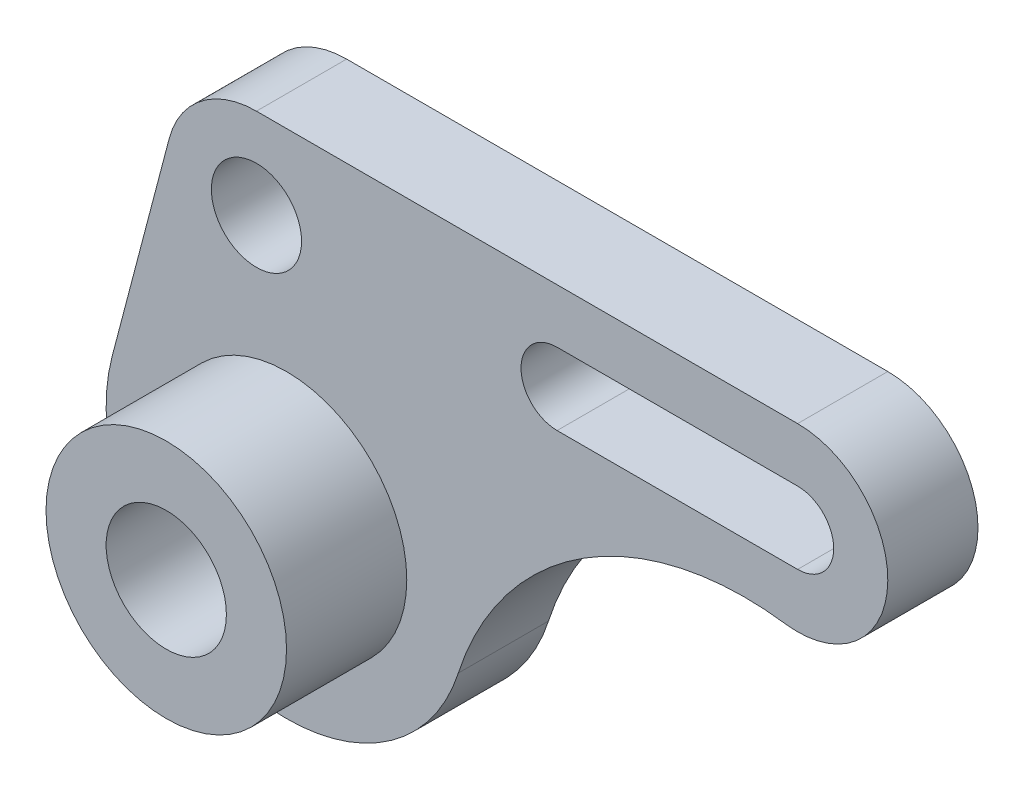
ISO-10303-21;
HEADER;
FILE_DESCRIPTION(('STEP AP214'),'2;1');
FILE_NAME('part.step','',(''),(''),'','','');
FILE_SCHEMA(('AUTOMOTIVE_DESIGN { 1 0 10303 214 1 1 1 1 }'));
ENDSEC;
DATA;
#1=APPLICATION_CONTEXT('core data for automotive mechanical design processes');
#2=APPLICATION_PROTOCOL_DEFINITION('international standard','automotive_design',2000,#1);
#3=PRODUCT_CONTEXT('',#1,'mechanical');
#4=PRODUCT('Part','Part','',(#3));
#5=PRODUCT_RELATED_PRODUCT_CATEGORY('part','',(#4));
#6=PRODUCT_DEFINITION_FORMATION('','',#4);
#7=PRODUCT_DEFINITION_CONTEXT('part definition',#1,'design');
#8=PRODUCT_DEFINITION('design','',#6,#7);
#9=PRODUCT_DEFINITION_SHAPE('','',#8);
#10=(LENGTH_UNIT() NAMED_UNIT(*) SI_UNIT(.MILLI.,.METRE.));
#11=(NAMED_UNIT(*) PLANE_ANGLE_UNIT() SI_UNIT($,.RADIAN.));
#12=(NAMED_UNIT(*) SI_UNIT($,.STERADIAN.) SOLID_ANGLE_UNIT());
#13=UNCERTAINTY_MEASURE_WITH_UNIT(LENGTH_MEASURE(1.E-05),#10,'distance_accuracy_value','');
#14=(GEOMETRIC_REPRESENTATION_CONTEXT(3) GLOBAL_UNCERTAINTY_ASSIGNED_CONTEXT((#13)) GLOBAL_UNIT_ASSIGNED_CONTEXT((#10,
#11,#12)) REPRESENTATION_CONTEXT('',''));
#15=CARTESIAN_POINT('',(0.,0.,0.));
#16=DIRECTION('',(0.,0.,1.));
#17=DIRECTION('',(1.,0.,0.));
#18=AXIS2_PLACEMENT_3D('',#15,#16,#17);
#19=CARTESIAN_POINT('',(0.,0.,15.));
#20=DIRECTION('',(0.,0.,-1.));
#21=DIRECTION('',(-1.,0.,0.));
#22=AXIS2_PLACEMENT_3D('',#19,#20,#21);
#23=CYLINDRICAL_SURFACE('',#22,6.);
#24=CARTESIAN_POINT('',(0.,0.,0.));
#25=DIRECTION('',(0.,0.,1.));
#26=DIRECTION('',(1.,0.,0.));
#27=AXIS2_PLACEMENT_3D('',#24,#25,#26);
#28=CIRCLE('',#27,6.);
#29=CARTESIAN_POINT('',(0.,6.,0.));
#30=VERTEX_POINT('',#29);
#31=CARTESIAN_POINT('',(0.,-6.,0.));
#32=VERTEX_POINT('',#31);
#33=EDGE_CURVE('E163',#30,#32,#28,.T.);
#34=ORIENTED_EDGE('',*,*,#33,.F.);
#35=DIRECTION('',(0.,0.,-1.));
#36=VECTOR('',#35,1.);
#37=CARTESIAN_POINT('',(0.,6.,15.));
#38=LINE('',#37,#36);
#39=CARTESIAN_POINT('',(0.,6.,15.));
#40=VERTEX_POINT('',#39);
#41=EDGE_CURVE('E11',#40,#30,#38,.T.);
#42=ORIENTED_EDGE('',*,*,#41,.F.);
#43=CARTESIAN_POINT('',(0.,0.,15.));
#44=DIRECTION('',(0.,0.,1.));
#45=DIRECTION('',(1.,0.,0.));
#46=AXIS2_PLACEMENT_3D('',#43,#44,#45);
#47=CIRCLE('',#46,6.);
#48=CARTESIAN_POINT('',(0.,-6.,15.));
#49=VERTEX_POINT('',#48);
#50=EDGE_CURVE('E128',#40,#49,#47,.T.);
#51=ORIENTED_EDGE('',*,*,#50,.T.);
#52=DIRECTION('',(0.,0.,-1.));
#53=VECTOR('',#52,1.);
#54=CARTESIAN_POINT('',(0.,-6.,15.));
#55=LINE('',#54,#53);
#56=EDGE_CURVE('E56',#49,#32,#55,.T.);
#57=ORIENTED_EDGE('',*,*,#56,.T.);
#58=EDGE_LOOP('',(#34,#42,#51,#57));
#59=FACE_BOUND('',#58,.T.);
#60=ADVANCED_FACE('F37',(#59),#23,.F.);
#61=CARTESIAN_POINT('',(0.,6.,15.));
#62=DIRECTION('',(0.,1.,0.));
#63=DIRECTION('',(-1.,0.,0.));
#64=AXIS2_PLACEMENT_3D('',#61,#62,#63);
#65=PLANE('',#64);
#66=DIRECTION('',(1.,0.,0.));
#67=VECTOR('',#66,1.);
#68=CARTESIAN_POINT('',(0.,6.,0.));
#69=LINE('',#68,#67);
#70=CARTESIAN_POINT('',(40.,5.99999999999999,0.));
#71=VERTEX_POINT('',#70);
#72=EDGE_CURVE('E134',#30,#71,#69,.T.);
#73=ORIENTED_EDGE('',*,*,#72,.T.);
#74=DIRECTION('',(0.,0.,-1.));
#75=VECTOR('',#74,1.);
#76=CARTESIAN_POINT('',(40.,5.99999999999999,15.));
#77=LINE('',#76,#75);
#78=CARTESIAN_POINT('',(40.,5.99999999999999,15.));
#79=VERTEX_POINT('',#78);
#80=EDGE_CURVE('E47',#79,#71,#77,.T.);
#81=ORIENTED_EDGE('',*,*,#80,.F.);
#82=DIRECTION('',(1.,0.,0.));
#83=VECTOR('',#82,1.);
#84=CARTESIAN_POINT('',(0.,6.,15.));
#85=LINE('',#84,#83);
#86=EDGE_CURVE('E122',#40,#79,#85,.T.);
#87=ORIENTED_EDGE('',*,*,#86,.F.);
#88=ORIENTED_EDGE('',*,*,#41,.T.);
#89=EDGE_LOOP('',(#73,#81,#87,#88));
#90=FACE_BOUND('',#89,.T.);
#91=ADVANCED_FACE('F132',(#90),#65,.F.);
#92=CARTESIAN_POINT('',(40.,0.,15.));
#93=DIRECTION('',(0.,0.,-1.));
#94=DIRECTION('',(-1.,0.,0.));
#95=AXIS2_PLACEMENT_3D('',#92,#93,#94);
#96=CYLINDRICAL_SURFACE('',#95,5.99999999999999);
#97=CARTESIAN_POINT('',(40.,0.,0.));
#98=DIRECTION('',(0.,0.,1.));
#99=DIRECTION('',(1.,0.,0.));
#100=AXIS2_PLACEMENT_3D('',#97,#98,#99);
#101=CIRCLE('',#100,5.99999999999999);
#102=CARTESIAN_POINT('',(40.,-5.99999999999999,0.));
#103=VERTEX_POINT('',#102);
#104=EDGE_CURVE('E166',#103,#71,#101,.T.);
#105=ORIENTED_EDGE('',*,*,#104,.F.);
#106=DIRECTION('',(0.,0.,-1.));
#107=VECTOR('',#106,1.);
#108=CARTESIAN_POINT('',(40.,-5.99999999999999,15.));
#109=LINE('',#108,#107);
#110=CARTESIAN_POINT('',(40.,-5.99999999999999,15.));
#111=VERTEX_POINT('',#110);
#112=EDGE_CURVE('E87',#111,#103,#109,.T.);
#113=ORIENTED_EDGE('',*,*,#112,.F.);
#114=CARTESIAN_POINT('',(40.,0.,15.));
#115=DIRECTION('',(0.,0.,1.));
#116=DIRECTION('',(1.,0.,0.));
#117=AXIS2_PLACEMENT_3D('',#114,#115,#116);
#118=CIRCLE('',#117,5.99999999999999);
#119=EDGE_CURVE('E127',#111,#79,#118,.T.);
#120=ORIENTED_EDGE('',*,*,#119,.T.);
#121=ORIENTED_EDGE('',*,*,#80,.T.);
#122=EDGE_LOOP('',(#105,#113,#120,#121));
#123=FACE_BOUND('',#122,.T.);
#124=ADVANCED_FACE('F138',(#123),#96,.F.);
#125=CARTESIAN_POINT('',(31.1882071883093,-64.3999402751574,15.));
#126=DIRECTION('',(0.,0.,-1.));
#127=DIRECTION('',(-1.,0.,0.));
#128=AXIS2_PLACEMENT_3D('',#125,#126,#127);
#129=CYLINDRICAL_SURFACE('',#128,50.);
#130=CARTESIAN_POINT('',(31.1882071883093,-64.3999402751574,0.));
#131=DIRECTION('',(0.,0.,1.));
#132=DIRECTION('',(1.,0.,0.));
#133=AXIS2_PLACEMENT_3D('',#130,#131,#132);
#134=CIRCLE('',#133,50.);
#135=CARTESIAN_POINT('',(37.9665093511483,-14.8615246788825,0.));
#136=VERTEX_POINT('',#135);
#137=CARTESIAN_POINT('',(-16.429422304384,-49.149977603184,0.));
#138=VERTEX_POINT('',#137);
#139=EDGE_CURVE('E145',#136,#138,#134,.T.);
#140=ORIENTED_EDGE('',*,*,#139,.F.);
#141=DIRECTION('',(0.,0.,-1.));
#142=VECTOR('',#141,1.);
#143=CARTESIAN_POINT('',(37.9665093511483,-14.8615246788825,15.));
#144=LINE('',#143,#142);
#145=CARTESIAN_POINT('',(37.9665093511483,-14.8615246788825,15.));
#146=VERTEX_POINT('',#145);
#147=EDGE_CURVE('E41',#146,#136,#144,.T.);
#148=ORIENTED_EDGE('',*,*,#147,.F.);
#149=CARTESIAN_POINT('',(31.1882071883093,-64.3999402751574,15.));
#150=DIRECTION('',(0.,0.,1.));
#151=DIRECTION('',(1.,0.,0.));
#152=AXIS2_PLACEMENT_3D('',#149,#150,#151);
#153=CIRCLE('',#152,50.);
#154=CARTESIAN_POINT('',(-16.429422304384,-49.149977603184,15.));
#155=VERTEX_POINT('',#154);
#156=EDGE_CURVE('E171',#146,#155,#153,.T.);
#157=ORIENTED_EDGE('',*,*,#156,.T.);
#158=DIRECTION('',(0.,0.,-1.));
#159=VECTOR('',#158,1.);
#160=CARTESIAN_POINT('',(-16.429422304384,-49.149977603184,15.));
#161=LINE('',#160,#159);
#162=EDGE_CURVE('E141',#155,#138,#161,.T.);
#163=ORIENTED_EDGE('',*,*,#162,.T.);
#164=EDGE_LOOP('',(#140,#148,#157,#163));
#165=FACE_BOUND('',#164,.T.);
#166=ADVANCED_FACE('F39',(#165),#129,.F.);
#167=CARTESIAN_POINT('',(40.,0.,15.));
#168=DIRECTION('',(0.,0.,-1.));
#169=DIRECTION('',(-1.,0.,0.));
#170=AXIS2_PLACEMENT_3D('',#167,#168,#169);
#171=CYLINDRICAL_SURFACE('',#170,15.);
#172=CARTESIAN_POINT('',(40.,0.,0.));
#173=DIRECTION('',(0.,0.,1.));
#174=DIRECTION('',(1.,0.,0.));
#175=AXIS2_PLACEMENT_3D('',#172,#173,#174);
#176=CIRCLE('',#175,15.);
#177=CARTESIAN_POINT('',(40.,15.,0.));
#178=VERTEX_POINT('',#177);
#179=EDGE_CURVE('E148',#136,#178,#176,.T.);
#180=ORIENTED_EDGE('',*,*,#179,.T.);
#181=DIRECTION('',(0.,0.,-1.));
#182=VECTOR('',#181,1.);
#183=CARTESIAN_POINT('',(40.,15.,15.));
#184=LINE('',#183,#182);
#185=CARTESIAN_POINT('',(40.,15.,15.));
#186=VERTEX_POINT('',#185);
#187=EDGE_CURVE('E183',#186,#178,#184,.T.);
#188=ORIENTED_EDGE('',*,*,#187,.F.);
#189=CARTESIAN_POINT('',(40.,0.,15.));
#190=DIRECTION('',(0.,0.,1.));
#191=DIRECTION('',(1.,0.,0.));
#192=AXIS2_PLACEMENT_3D('',#189,#190,#191);
#193=CIRCLE('',#192,15.);
#194=EDGE_CURVE('E192',#146,#186,#193,.T.);
#195=ORIENTED_EDGE('',*,*,#194,.F.);
#196=ORIENTED_EDGE('',*,*,#147,.T.);
#197=EDGE_LOOP('',(#180,#188,#195,#196));
#198=FACE_BOUND('',#197,.T.);
#199=ADVANCED_FACE('F191',(#198),#171,.T.);
#200=CARTESIAN_POINT('',(0.,15.,15.));
#201=DIRECTION('',(0.,-1.,0.));
#202=DIRECTION('',(1.,0.,0.));
#203=AXIS2_PLACEMENT_3D('',#200,#201,#202);
#204=PLANE('',#203);
#205=DIRECTION('',(-1.,0.,0.));
#206=VECTOR('',#205,1.);
#207=CARTESIAN_POINT('',(0.,15.,0.));
#208=LINE('',#207,#206);
#209=CARTESIAN_POINT('',(-50.,15.,0.));
#210=VERTEX_POINT('',#209);
#211=EDGE_CURVE('E151',#178,#210,#208,.T.);
#212=ORIENTED_EDGE('',*,*,#211,.T.);
#213=DIRECTION('',(0.,0.,-1.));
#214=VECTOR('',#213,1.);
#215=CARTESIAN_POINT('',(-50.,15.,15.));
#216=LINE('',#215,#214);
#217=CARTESIAN_POINT('',(-50.,15.,15.));
#218=VERTEX_POINT('',#217);
#219=EDGE_CURVE('E181',#218,#210,#216,.T.);
#220=ORIENTED_EDGE('',*,*,#219,.F.);
#221=DIRECTION('',(-1.,0.,0.));
#222=VECTOR('',#221,1.);
#223=CARTESIAN_POINT('',(0.,15.,15.));
#224=LINE('',#223,#222);
#225=EDGE_CURVE('E216',#186,#218,#224,.T.);
#226=ORIENTED_EDGE('',*,*,#225,.F.);
#227=ORIENTED_EDGE('',*,*,#187,.T.);
#228=EDGE_LOOP('',(#212,#220,#226,#227));
#229=FACE_BOUND('',#228,.T.);
#230=ADVANCED_FACE('F215',(#229),#204,.F.);
#231=CARTESIAN_POINT('',(-50.,0.,15.));
#232=DIRECTION('',(0.,0.,-1.));
#233=DIRECTION('',(-1.,0.,0.));
#234=AXIS2_PLACEMENT_3D('',#231,#232,#233);
#235=CYLINDRICAL_SURFACE('',#234,15.);
#236=CARTESIAN_POINT('',(-50.,0.,0.));
#237=DIRECTION('',(0.,0.,1.));
#238=DIRECTION('',(1.,0.,0.));
#239=AXIS2_PLACEMENT_3D('',#236,#237,#238);
#240=CIRCLE('',#239,15.);
#241=CARTESIAN_POINT('',(-64.507658043473,3.81154274456587,0.));
#242=VERTEX_POINT('',#241);
#243=EDGE_CURVE('E153',#210,#242,#240,.T.);
#244=ORIENTED_EDGE('',*,*,#243,.T.);
#245=DIRECTION('',(0.,0.,-1.));
#246=VECTOR('',#245,1.);
#247=CARTESIAN_POINT('',(-64.507658043473,3.81154274456587,15.));
#248=LINE('',#247,#246);
#249=CARTESIAN_POINT('',(-64.507658043473,3.81154274456587,15.));
#250=VERTEX_POINT('',#249);
#251=EDGE_CURVE('E178',#250,#242,#248,.T.);
#252=ORIENTED_EDGE('',*,*,#251,.F.);
#253=CARTESIAN_POINT('',(-50.,0.,15.));
#254=DIRECTION('',(0.,0.,1.));
#255=DIRECTION('',(1.,0.,0.));
#256=AXIS2_PLACEMENT_3D('',#253,#254,#255);
#257=CIRCLE('',#256,15.);
#258=EDGE_CURVE('E213',#218,#250,#257,.T.);
#259=ORIENTED_EDGE('',*,*,#258,.F.);
#260=ORIENTED_EDGE('',*,*,#219,.T.);
#261=EDGE_LOOP('',(#244,#252,#259,#260));
#262=FACE_BOUND('',#261,.T.);
#263=ADVANCED_FACE('F212',(#262),#235,.T.);
#264=CARTESIAN_POINT('',(-61.2792451337724,16.0996669126197,15.));
#265=DIRECTION('',(0.967177202898201,-0.254102849637725,0.));
#266=DIRECTION('',(0.254102849637725,0.967177202898201,0.));
#267=AXIS2_PLACEMENT_3D('',#264,#265,#266);
#268=PLANE('',#267);
#269=DIRECTION('',(-0.254102849637725,-0.967177202898201,0.));
#270=VECTOR('',#269,1.);
#271=CARTESIAN_POINT('',(-61.2792451337724,16.0996669126197,0.));
#272=LINE('',#271,#270);
#273=CARTESIAN_POINT('',(-74.015316086946,-32.3769145108683,0.));
#274=VERTEX_POINT('',#273);
#275=EDGE_CURVE('E155',#242,#274,#272,.T.);
#276=ORIENTED_EDGE('',*,*,#275,.T.);
#277=DIRECTION('',(0.,0.,-1.));
#278=VECTOR('',#277,1.);
#279=CARTESIAN_POINT('',(-74.015316086946,-32.3769145108683,15.));
#280=LINE('',#279,#278);
#281=CARTESIAN_POINT('',(-74.015316086946,-32.3769145108683,15.));
#282=VERTEX_POINT('',#281);
#283=EDGE_CURVE('E175',#282,#274,#280,.T.);
#284=ORIENTED_EDGE('',*,*,#283,.F.);
#285=DIRECTION('',(-0.254102849637725,-0.967177202898201,0.));
#286=VECTOR('',#285,1.);
#287=CARTESIAN_POINT('',(-61.2792451337724,16.0996669126197,15.));
#288=LINE('',#287,#286);
#289=EDGE_CURVE('E209',#250,#282,#288,.T.);
#290=ORIENTED_EDGE('',*,*,#289,.F.);
#291=ORIENTED_EDGE('',*,*,#251,.T.);
#292=EDGE_LOOP('',(#276,#284,#290,#291));
#293=FACE_BOUND('',#292,.T.);
#294=ADVANCED_FACE('F206',(#293),#268,.F.);
#295=CARTESIAN_POINT('',(-50.,0.,15.));
#296=DIRECTION('',(0.,0.,-1.));
#297=DIRECTION('',(-1.,0.,0.));
#298=AXIS2_PLACEMENT_3D('',#295,#296,#297);
#299=CYLINDRICAL_SURFACE('',#298,7.5);
#300=CARTESIAN_POINT('',(-50.,0.,15.));
#301=DIRECTION('',(0.,0.,1.));
#302=DIRECTION('',(1.,0.,0.));
#303=AXIS2_PLACEMENT_3D('',#300,#301,#302);
#304=CIRCLE('',#303,7.5);
#305=CARTESIAN_POINT('',(-42.5,0.,15.));
#306=VERTEX_POINT('',#305);
#307=EDGE_CURVE('E229',#306,#306,#304,.T.);
#308=ORIENTED_EDGE('',*,*,#307,.T.);
#309=EDGE_LOOP('',(#308));
#310=FACE_BOUND('',#309,.T.);
#311=CARTESIAN_POINT('',(-50.,0.,0.));
#312=DIRECTION('',(0.,0.,1.));
#313=DIRECTION('',(1.,0.,0.));
#314=AXIS2_PLACEMENT_3D('',#311,#312,#313);
#315=CIRCLE('',#314,7.5);
#316=CARTESIAN_POINT('',(-42.5,0.,0.));
#317=VERTEX_POINT('',#316);
#318=EDGE_CURVE('E160',#317,#317,#315,.T.);
#319=ORIENTED_EDGE('',*,*,#318,.F.);
#320=EDGE_LOOP('',(#319));
#321=FACE_BOUND('',#320,.T.);
#322=ADVANCED_FACE('F239',(#310,#321),#299,.F.);
#323=CARTESIAN_POINT('',(-45.,-40.,15.));
#324=DIRECTION('',(0.,0.,-1.));
#325=DIRECTION('',(-1.,0.,0.));
#326=AXIS2_PLACEMENT_3D('',#323,#324,#325);
#327=CYLINDRICAL_SURFACE('',#326,30.);
#328=CARTESIAN_POINT('',(-45.,-40.,0.));
#329=DIRECTION('',(0.,0.,1.));
#330=DIRECTION('',(1.,0.,0.));
#331=AXIS2_PLACEMENT_3D('',#328,#329,#330);
#332=CIRCLE('',#331,30.);
#333=EDGE_CURVE('E157',#274,#138,#332,.T.);
#334=ORIENTED_EDGE('',*,*,#333,.T.);
#335=ORIENTED_EDGE('',*,*,#162,.F.);
#336=CARTESIAN_POINT('',(-45.,-40.,15.));
#337=DIRECTION('',(0.,0.,1.));
#338=DIRECTION('',(1.,0.,0.));
#339=AXIS2_PLACEMENT_3D('',#336,#337,#338);
#340=CIRCLE('',#339,30.);
#341=EDGE_CURVE('E224',#282,#155,#340,.T.);
#342=ORIENTED_EDGE('',*,*,#341,.F.);
#343=ORIENTED_EDGE('',*,*,#283,.T.);
#344=EDGE_LOOP('',(#334,#335,#342,#343));
#345=FACE_BOUND('',#344,.T.);
#346=ADVANCED_FACE('F202',(#345),#327,.T.);
#347=CARTESIAN_POINT('',(0.,-6.,15.));
#348=DIRECTION('',(0.,1.,0.));
#349=DIRECTION('',(-1.,0.,0.));
#350=AXIS2_PLACEMENT_3D('',#347,#348,#349);
#351=PLANE('',#350);
#352=DIRECTION('',(1.,0.,0.));
#353=VECTOR('',#352,1.);
#354=CARTESIAN_POINT('',(0.,-6.,0.));
#355=LINE('',#354,#353);
#356=EDGE_CURVE('E168',#32,#103,#355,.T.);
#357=ORIENTED_EDGE('',*,*,#356,.F.);
#358=ORIENTED_EDGE('',*,*,#56,.F.);
#359=DIRECTION('',(1.,0.,0.));
#360=VECTOR('',#359,1.);
#361=CARTESIAN_POINT('',(0.,-6.,15.));
#362=LINE('',#361,#360);
#363=EDGE_CURVE('E139',#49,#111,#362,.T.);
#364=ORIENTED_EDGE('',*,*,#363,.T.);
#365=ORIENTED_EDGE('',*,*,#112,.T.);
#366=EDGE_LOOP('',(#357,#358,#364,#365));
#367=FACE_BOUND('',#366,.T.);
#368=ADVANCED_FACE('F231',(#367),#351,.T.);
#369=CARTESIAN_POINT('',(0.,0.,15.));
#370=DIRECTION('',(0.,0.,1.));
#371=DIRECTION('',(1.,0.,0.));
#372=AXIS2_PLACEMENT_3D('',#369,#370,#371);
#373=PLANE('',#372);
#374=ORIENTED_EDGE('',*,*,#156,.F.);
#375=ORIENTED_EDGE('',*,*,#194,.T.);
#376=ORIENTED_EDGE('',*,*,#225,.T.);
#377=ORIENTED_EDGE('',*,*,#258,.T.);
#378=ORIENTED_EDGE('',*,*,#289,.T.);
#379=ORIENTED_EDGE('',*,*,#341,.T.);
#380=EDGE_LOOP('',(#374,#375,#376,#377,#378,#379));
#381=FACE_BOUND('',#380,.T.);
#382=CARTESIAN_POINT('',(-45.,-40.,15.));
#383=DIRECTION('',(0.,0.,1.));
#384=DIRECTION('',(1.,0.,0.));
#385=AXIS2_PLACEMENT_3D('',#382,#383,#384);
#386=CIRCLE('',#385,20.);
#387=CARTESIAN_POINT('',(-25.,-40.,15.));
#388=VERTEX_POINT('',#387);
#389=EDGE_CURVE('E226',#388,#388,#386,.T.);
#390=ORIENTED_EDGE('',*,*,#389,.F.);
#391=EDGE_LOOP('',(#390));
#392=FACE_BOUND('',#391,.T.);
#393=ORIENTED_EDGE('',*,*,#307,.F.);
#394=EDGE_LOOP('',(#393));
#395=FACE_BOUND('',#394,.T.);
#396=ORIENTED_EDGE('',*,*,#50,.F.);
#397=ORIENTED_EDGE('',*,*,#86,.T.);
#398=ORIENTED_EDGE('',*,*,#119,.F.);
#399=ORIENTED_EDGE('',*,*,#363,.F.);
#400=EDGE_LOOP('',(#396,#397,#398,#399));
#401=FACE_BOUND('',#400,.T.);
#402=ADVANCED_FACE('F124',(#381,#392,#395,#401),#373,.T.);
#403=CARTESIAN_POINT('',(0.,0.,0.));
#404=DIRECTION('',(0.,0.,1.));
#405=DIRECTION('',(1.,0.,0.));
#406=AXIS2_PLACEMENT_3D('',#403,#404,#405);
#407=PLANE('',#406);
#408=ORIENTED_EDGE('',*,*,#139,.T.);
#409=ORIENTED_EDGE('',*,*,#333,.F.);
#410=ORIENTED_EDGE('',*,*,#275,.F.);
#411=ORIENTED_EDGE('',*,*,#243,.F.);
#412=ORIENTED_EDGE('',*,*,#211,.F.);
#413=ORIENTED_EDGE('',*,*,#179,.F.);
#414=EDGE_LOOP('',(#408,#409,#410,#411,#412,#413));
#415=FACE_BOUND('',#414,.T.);
#416=ORIENTED_EDGE('',*,*,#318,.T.);
#417=EDGE_LOOP('',(#416));
#418=FACE_BOUND('',#417,.T.);
#419=ORIENTED_EDGE('',*,*,#33,.T.);
#420=ORIENTED_EDGE('',*,*,#356,.T.);
#421=ORIENTED_EDGE('',*,*,#104,.T.);
#422=ORIENTED_EDGE('',*,*,#72,.F.);
#423=EDGE_LOOP('',(#419,#420,#421,#422));
#424=FACE_BOUND('',#423,.T.);
#425=CARTESIAN_POINT('',(-45.,-40.,0.));
#426=DIRECTION('',(0.,0.,1.));
#427=DIRECTION('',(1.,0.,0.));
#428=AXIS2_PLACEMENT_3D('',#425,#426,#427);
#429=CIRCLE('',#428,10.);
#430=CARTESIAN_POINT('',(-35.,-40.,0.));
#431=VERTEX_POINT('',#430);
#432=EDGE_CURVE('E372',#431,#431,#429,.T.);
#433=ORIENTED_EDGE('',*,*,#432,.T.);
#434=EDGE_LOOP('',(#433));
#435=FACE_BOUND('',#434,.T.);
#436=ADVANCED_FACE('F195',(#415,#418,#424,#435),#407,.F.);
#437=CARTESIAN_POINT('',(-45.,-40.,35.));
#438=DIRECTION('',(0.,0.,-1.));
#439=DIRECTION('',(-1.,0.,0.));
#440=AXIS2_PLACEMENT_3D('',#437,#438,#439);
#441=CYLINDRICAL_SURFACE('',#440,10.);
#442=CARTESIAN_POINT('',(-45.,-40.,35.));
#443=DIRECTION('',(0.,0.,1.));
#444=DIRECTION('',(1.,0.,0.));
#445=AXIS2_PLACEMENT_3D('',#442,#443,#444);
#446=CIRCLE('',#445,10.);
#447=CARTESIAN_POINT('',(-35.,-40.,35.));
#448=VERTEX_POINT('',#447);
#449=EDGE_CURVE('E367',#448,#448,#446,.T.);
#450=ORIENTED_EDGE('',*,*,#449,.T.);
#451=EDGE_LOOP('',(#450));
#452=FACE_BOUND('',#451,.T.);
#453=ORIENTED_EDGE('',*,*,#432,.F.);
#454=EDGE_LOOP('',(#453));
#455=FACE_BOUND('',#454,.T.);
#456=ADVANCED_FACE('F329',(#452,#455),#441,.F.);
#457=CARTESIAN_POINT('',(-45.,-40.,35.));
#458=DIRECTION('',(0.,0.,-1.));
#459=DIRECTION('',(-1.,0.,0.));
#460=AXIS2_PLACEMENT_3D('',#457,#458,#459);
#461=CYLINDRICAL_SURFACE('',#460,20.);
#462=ORIENTED_EDGE('',*,*,#389,.T.);
#463=EDGE_LOOP('',(#462));
#464=FACE_BOUND('',#463,.T.);
#465=CARTESIAN_POINT('',(-45.,-40.,35.));
#466=DIRECTION('',(0.,0.,1.));
#467=DIRECTION('',(1.,0.,0.));
#468=AXIS2_PLACEMENT_3D('',#465,#466,#467);
#469=CIRCLE('',#468,20.);
#470=CARTESIAN_POINT('',(-25.,-40.,35.));
#471=VERTEX_POINT('',#470);
#472=EDGE_CURVE('E149',#471,#471,#469,.T.);
#473=ORIENTED_EDGE('',*,*,#472,.F.);
#474=EDGE_LOOP('',(#473));
#475=FACE_BOUND('',#474,.T.);
#476=ADVANCED_FACE('F339',(#464,#475),#461,.T.);
#477=CARTESIAN_POINT('',(0.,0.,35.));
#478=DIRECTION('',(0.,0.,1.));
#479=DIRECTION('',(1.,0.,0.));
#480=AXIS2_PLACEMENT_3D('',#477,#478,#479);
#481=PLANE('',#480);
#482=ORIENTED_EDGE('',*,*,#449,.F.);
#483=EDGE_LOOP('',(#482));
#484=FACE_BOUND('',#483,.T.);
#485=ORIENTED_EDGE('',*,*,#472,.T.);
#486=EDGE_LOOP('',(#485));
#487=FACE_BOUND('',#486,.T.);
#488=ADVANCED_FACE('F348',(#484,#487),#481,.T.);
#489=CLOSED_SHELL('',(#60,#91,#124,#166,#199,#230,#263,#294,#322,#346,#368,#402,#436,#456,#476,#488));
#490=MANIFOLD_SOLID_BREP('B2',#489);
#491=ADVANCED_BREP_SHAPE_REPRESENTATION('',(#18,#490),#14);
#492=SHAPE_DEFINITION_REPRESENTATION(#9,#491);
ENDSEC;
END-ISO-10303-21;
